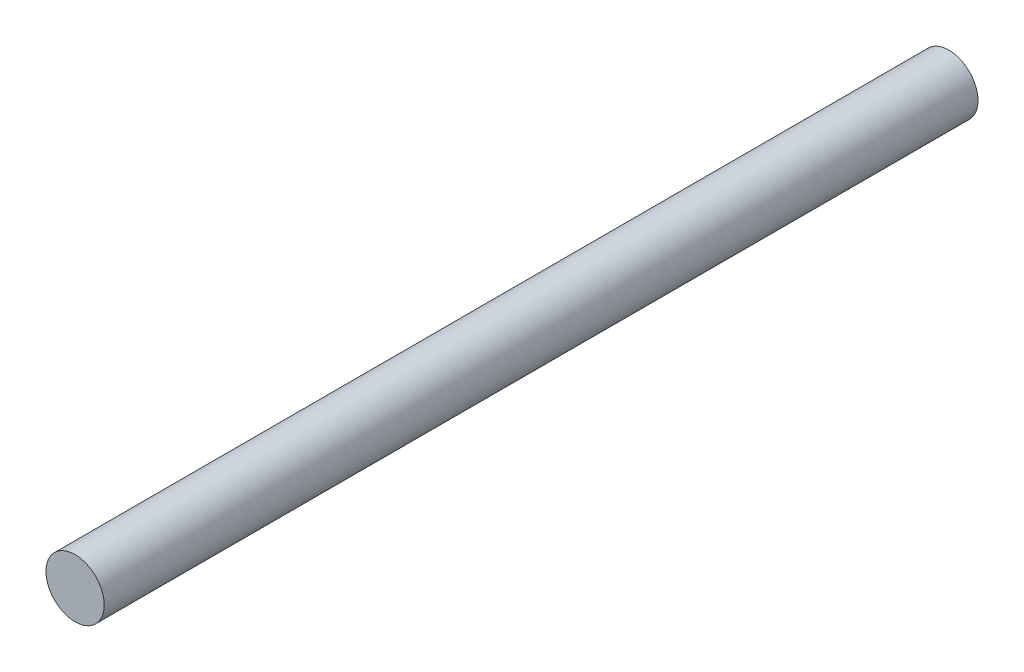
ISO-10303-21;
HEADER;
FILE_DESCRIPTION(('STEP AP214'),'2;1');
FILE_NAME('part.step','',(''),(''),'','','');
FILE_SCHEMA(('AUTOMOTIVE_DESIGN { 1 0 10303 214 1 1 1 1 }'));
ENDSEC;
DATA;
#1=APPLICATION_CONTEXT('core data for automotive mechanical design processes');
#2=APPLICATION_PROTOCOL_DEFINITION('international standard','automotive_design',2000,#1);
#3=PRODUCT_CONTEXT('',#1,'mechanical');
#4=PRODUCT('Part','Part','',(#3));
#5=PRODUCT_RELATED_PRODUCT_CATEGORY('part','',(#4));
#6=PRODUCT_DEFINITION_FORMATION('','',#4);
#7=PRODUCT_DEFINITION_CONTEXT('part definition',#1,'design');
#8=PRODUCT_DEFINITION('design','',#6,#7);
#9=PRODUCT_DEFINITION_SHAPE('','',#8);
#10=(LENGTH_UNIT() NAMED_UNIT(*) SI_UNIT(.MILLI.,.METRE.));
#11=(NAMED_UNIT(*) PLANE_ANGLE_UNIT() SI_UNIT($,.RADIAN.));
#12=(NAMED_UNIT(*) SI_UNIT($,.STERADIAN.) SOLID_ANGLE_UNIT());
#13=UNCERTAINTY_MEASURE_WITH_UNIT(LENGTH_MEASURE(1.E-05),#10,'distance_accuracy_value','');
#14=(GEOMETRIC_REPRESENTATION_CONTEXT(3) GLOBAL_UNCERTAINTY_ASSIGNED_CONTEXT((#13)) GLOBAL_UNIT_ASSIGNED_CONTEXT((#10,
#11,#12)) REPRESENTATION_CONTEXT('',''));
#15=CARTESIAN_POINT('',(0.,0.,0.));
#16=DIRECTION('',(0.,0.,1.));
#17=DIRECTION('',(1.,0.,0.));
#18=AXIS2_PLACEMENT_3D('',#15,#16,#17);
#19=CARTESIAN_POINT('',(0.,0.,75.));
#20=DIRECTION('',(0.,0.,-1.));
#21=DIRECTION('',(-1.,0.,0.));
#22=AXIS2_PLACEMENT_3D('',#19,#20,#21);
#23=CYLINDRICAL_SURFACE('',#22,2.5);
#24=CARTESIAN_POINT('',(0.,0.,75.));
#25=DIRECTION('',(0.,0.,1.));
#26=DIRECTION('',(1.,0.,0.));
#27=AXIS2_PLACEMENT_3D('',#24,#25,#26);
#28=CIRCLE('',#27,2.5);
#29=CARTESIAN_POINT('',(2.5,0.,75.));
#30=VERTEX_POINT('',#29);
#31=EDGE_CURVE('E10',#30,#30,#28,.T.);
#32=ORIENTED_EDGE('',*,*,#31,.F.);
#33=EDGE_LOOP('',(#32));
#34=FACE_BOUND('',#33,.T.);
#35=CARTESIAN_POINT('',(0.,0.,0.));
#36=DIRECTION('',(0.,0.,1.));
#37=DIRECTION('',(1.,0.,0.));
#38=AXIS2_PLACEMENT_3D('',#35,#36,#37);
#39=CIRCLE('',#38,2.5);
#40=CARTESIAN_POINT('',(2.5,0.,0.));
#41=VERTEX_POINT('',#40);
#42=EDGE_CURVE('E31',#41,#41,#39,.T.);
#43=ORIENTED_EDGE('',*,*,#42,.T.);
#44=EDGE_LOOP('',(#43));
#45=FACE_BOUND('',#44,.T.);
#46=ADVANCED_FACE('F28',(#34,#45),#23,.T.);
#47=CARTESIAN_POINT('',(0.,0.,75.));
#48=DIRECTION('',(0.,0.,1.));
#49=DIRECTION('',(1.,0.,0.));
#50=AXIS2_PLACEMENT_3D('',#47,#48,#49);
#51=PLANE('',#50);
#52=ORIENTED_EDGE('',*,*,#31,.T.);
#53=EDGE_LOOP('',(#52));
#54=FACE_BOUND('',#53,.T.);
#55=ADVANCED_FACE('F43',(#54),#51,.T.);
#56=CARTESIAN_POINT('',(0.,0.,0.));
#57=DIRECTION('',(0.,0.,1.));
#58=DIRECTION('',(1.,0.,0.));
#59=AXIS2_PLACEMENT_3D('',#56,#57,#58);
#60=PLANE('',#59);
#61=ORIENTED_EDGE('',*,*,#42,.F.);
#62=EDGE_LOOP('',(#61));
#63=FACE_BOUND('',#62,.T.);
#64=ADVANCED_FACE('F41',(#63),#60,.F.);
#65=CLOSED_SHELL('',(#46,#55,#64));
#66=MANIFOLD_SOLID_BREP('B2',#65);
#67=ADVANCED_BREP_SHAPE_REPRESENTATION('',(#18,#66),#14);
#68=SHAPE_DEFINITION_REPRESENTATION(#9,#67);
ENDSEC;
END-ISO-10303-21;
